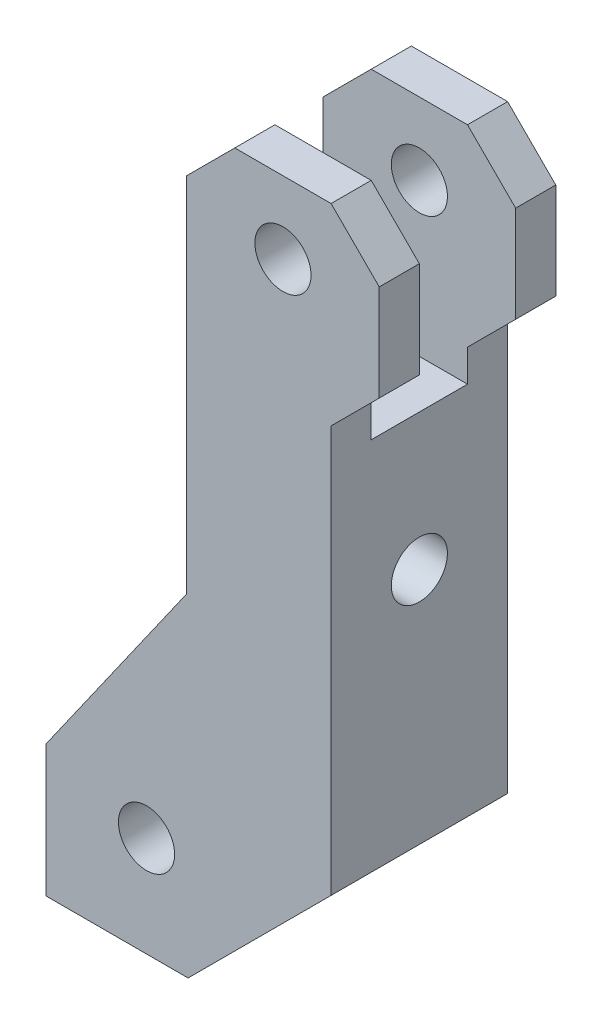
ISO-10303-21;
HEADER;
FILE_DESCRIPTION(('STEP AP214'),'2;1');
FILE_NAME('part.step','',(''),(''),'','','');
FILE_SCHEMA(('AUTOMOTIVE_DESIGN { 1 0 10303 214 1 1 1 1 }'));
ENDSEC;
DATA;
#1=APPLICATION_CONTEXT('core data for automotive mechanical design processes');
#2=APPLICATION_PROTOCOL_DEFINITION('international standard','automotive_design',2000,#1);
#3=PRODUCT_CONTEXT('',#1,'mechanical');
#4=PRODUCT('Part','Part','',(#3));
#5=PRODUCT_RELATED_PRODUCT_CATEGORY('part','',(#4));
#6=PRODUCT_DEFINITION_FORMATION('','',#4);
#7=PRODUCT_DEFINITION_CONTEXT('part definition',#1,'design');
#8=PRODUCT_DEFINITION('design','',#6,#7);
#9=PRODUCT_DEFINITION_SHAPE('','',#8);
#10=(LENGTH_UNIT() NAMED_UNIT(*) SI_UNIT(.MILLI.,.METRE.));
#11=(NAMED_UNIT(*) PLANE_ANGLE_UNIT() SI_UNIT($,.RADIAN.));
#12=(NAMED_UNIT(*) SI_UNIT($,.STERADIAN.) SOLID_ANGLE_UNIT());
#13=UNCERTAINTY_MEASURE_WITH_UNIT(LENGTH_MEASURE(1.E-05),#10,'distance_accuracy_value','');
#14=(GEOMETRIC_REPRESENTATION_CONTEXT(3) GLOBAL_UNCERTAINTY_ASSIGNED_CONTEXT((#13)) GLOBAL_UNIT_ASSIGNED_CONTEXT((#10,
#11,#12)) REPRESENTATION_CONTEXT('',''));
#15=CARTESIAN_POINT('',(0.,0.,0.));
#16=DIRECTION('',(0.,0.,1.));
#17=DIRECTION('',(1.,0.,0.));
#18=AXIS2_PLACEMENT_3D('',#15,#16,#17);
#19=CARTESIAN_POINT('',(23.,56.,-123.382937420455));
#20=DIRECTION('',(-0.707106781186542,0.707106781186553,0.));
#21=DIRECTION('',(-0.707106781186553,-0.707106781186542,0.));
#22=AXIS2_PLACEMENT_3D('',#19,#20,#21);
#23=PLANE('',#22);
#24=DIRECTION('',(-0.707106781186553,-0.707106781186542,0.));
#25=VECTOR('',#24,1.);
#26=CARTESIAN_POINT('',(23.,56.,-4.99999999999996));
#27=LINE('',#26,#25);
#28=CARTESIAN_POINT('',(29.,61.9999999999999,-4.99999999999996));
#29=VERTEX_POINT('',#28);
#30=CARTESIAN_POINT('',(23.,56.,-4.99999999999996));
#31=VERTEX_POINT('',#30);
#32=EDGE_CURVE('E163',#29,#31,#27,.T.);
#33=ORIENTED_EDGE('',*,*,#32,.F.);
#34=DIRECTION('',(0.,0.,1.));
#35=VECTOR('',#34,1.);
#36=CARTESIAN_POINT('',(29.,61.9999999999999,-123.382937420455));
#37=LINE('',#36,#35);
#38=CARTESIAN_POINT('',(29.,61.9999999999999,0.));
#39=VERTEX_POINT('',#38);
#40=EDGE_CURVE('E271',#29,#39,#37,.T.);
#41=ORIENTED_EDGE('',*,*,#40,.T.);
#42=DIRECTION('',(-0.707106781186553,-0.707106781186542,0.));
#43=VECTOR('',#42,1.);
#44=CARTESIAN_POINT('',(23.,56.,0.));
#45=LINE('',#44,#43);
#46=CARTESIAN_POINT('',(23.,56.,0.));
#47=VERTEX_POINT('',#46);
#48=EDGE_CURVE('E252',#39,#47,#45,.T.);
#49=ORIENTED_EDGE('',*,*,#48,.T.);
#50=DIRECTION('',(0.,0.,1.));
#51=VECTOR('',#50,1.);
#52=CARTESIAN_POINT('',(23.,56.,-123.382937420455));
#53=LINE('',#52,#51);
#54=EDGE_CURVE('E268',#31,#47,#53,.T.);
#55=ORIENTED_EDGE('',*,*,#54,.F.);
#56=EDGE_LOOP('',(#33,#41,#49,#55));
#57=FACE_BOUND('',#56,.T.);
#58=ADVANCED_FACE('F30',(#57),#23,.F.);
#59=CARTESIAN_POINT('',(29.,61.9999999999999,-123.382937420455));
#60=DIRECTION('',(-1.,0.,0.));
#61=DIRECTION('',(0.,0.,1.));
#62=AXIS2_PLACEMENT_3D('',#59,#60,#61);
#63=PLANE('',#62);
#64=DIRECTION('',(0.,-1.,0.));
#65=VECTOR('',#64,1.);
#66=CARTESIAN_POINT('',(29.,61.9999999999999,-4.99999999999996));
#67=LINE('',#66,#65);
#68=CARTESIAN_POINT('',(29.,74.,-4.99999999999996));
#69=VERTEX_POINT('',#68);
#70=EDGE_CURVE('E370',#69,#29,#67,.T.);
#71=ORIENTED_EDGE('',*,*,#70,.F.);
#72=DIRECTION('',(0.,0.,1.));
#73=VECTOR('',#72,1.);
#74=CARTESIAN_POINT('',(29.,74.,-123.382937420455));
#75=LINE('',#74,#73);
#76=CARTESIAN_POINT('',(29.,74.,0.));
#77=VERTEX_POINT('',#76);
#78=EDGE_CURVE('E275',#69,#77,#75,.T.);
#79=ORIENTED_EDGE('',*,*,#78,.T.);
#80=DIRECTION('',(0.,-1.,0.));
#81=VECTOR('',#80,1.);
#82=CARTESIAN_POINT('',(29.,61.9999999999999,0.));
#83=LINE('',#82,#81);
#84=EDGE_CURVE('E249',#77,#39,#83,.T.);
#85=ORIENTED_EDGE('',*,*,#84,.T.);
#86=ORIENTED_EDGE('',*,*,#40,.F.);
#87=EDGE_LOOP('',(#71,#79,#85,#86));
#88=FACE_BOUND('',#87,.T.);
#89=ADVANCED_FACE('F377',(#88),#63,.F.);
#90=CARTESIAN_POINT('',(29.,74.,-123.382937420455));
#91=DIRECTION('',(-0.707106781186549,-0.707106781186546,0.));
#92=DIRECTION('',(0.707106781186546,-0.707106781186549,0.));
#93=AXIS2_PLACEMENT_3D('',#90,#91,#92);
#94=PLANE('',#93);
#95=DIRECTION('',(0.707106781186546,-0.707106781186549,0.));
#96=VECTOR('',#95,1.);
#97=CARTESIAN_POINT('',(29.,74.,-4.99999999999996));
#98=LINE('',#97,#96);
#99=CARTESIAN_POINT('',(23.,80.,-4.99999999999996));
#100=VERTEX_POINT('',#99);
#101=EDGE_CURVE('E365',#100,#69,#98,.T.);
#102=ORIENTED_EDGE('',*,*,#101,.F.);
#103=DIRECTION('',(0.,0.,1.));
#104=VECTOR('',#103,1.);
#105=CARTESIAN_POINT('',(23.,80.,-123.382937420455));
#106=LINE('',#105,#104);
#107=CARTESIAN_POINT('',(23.,80.,0.));
#108=VERTEX_POINT('',#107);
#109=EDGE_CURVE('E279',#100,#108,#106,.T.);
#110=ORIENTED_EDGE('',*,*,#109,.T.);
#111=DIRECTION('',(0.707106781186546,-0.707106781186549,0.));
#112=VECTOR('',#111,1.);
#113=CARTESIAN_POINT('',(29.,74.,0.));
#114=LINE('',#113,#112);
#115=EDGE_CURVE('E246',#108,#77,#114,.T.);
#116=ORIENTED_EDGE('',*,*,#115,.T.);
#117=ORIENTED_EDGE('',*,*,#78,.F.);
#118=EDGE_LOOP('',(#102,#110,#116,#117));
#119=FACE_BOUND('',#118,.T.);
#120=ADVANCED_FACE('F401',(#119),#94,.F.);
#121=CARTESIAN_POINT('',(23.,80.,-123.382937420455));
#122=DIRECTION('',(0.,-1.,0.));
#123=DIRECTION('',(0.,0.,-1.));
#124=AXIS2_PLACEMENT_3D('',#121,#122,#123);
#125=PLANE('',#124);
#126=DIRECTION('',(1.,0.,0.));
#127=VECTOR('',#126,1.);
#128=CARTESIAN_POINT('',(23.,80.,-4.99999999999996));
#129=LINE('',#128,#127);
#130=CARTESIAN_POINT('',(11.,80.,-4.99999999999996));
#131=VERTEX_POINT('',#130);
#132=EDGE_CURVE('E363',#131,#100,#129,.T.);
#133=ORIENTED_EDGE('',*,*,#132,.F.);
#134=DIRECTION('',(0.,0.,1.));
#135=VECTOR('',#134,1.);
#136=CARTESIAN_POINT('',(11.,80.,-123.382937420455));
#137=LINE('',#136,#135);
#138=CARTESIAN_POINT('',(11.,80.,0.));
#139=VERTEX_POINT('',#138);
#140=EDGE_CURVE('E283',#131,#139,#137,.T.);
#141=ORIENTED_EDGE('',*,*,#140,.T.);
#142=DIRECTION('',(1.,0.,0.));
#143=VECTOR('',#142,1.);
#144=CARTESIAN_POINT('',(23.,80.,0.));
#145=LINE('',#144,#143);
#146=EDGE_CURVE('E243',#139,#108,#145,.T.);
#147=ORIENTED_EDGE('',*,*,#146,.T.);
#148=ORIENTED_EDGE('',*,*,#109,.F.);
#149=EDGE_LOOP('',(#133,#141,#147,#148));
#150=FACE_BOUND('',#149,.T.);
#151=ADVANCED_FACE('F414',(#150),#125,.F.);
#152=CARTESIAN_POINT('',(11.,80.,-123.382937420455));
#153=DIRECTION('',(0.707106781186546,-0.707106781186549,0.));
#154=DIRECTION('',(0.707106781186549,0.707106781186546,0.));
#155=AXIS2_PLACEMENT_3D('',#152,#153,#154);
#156=PLANE('',#155);
#157=DIRECTION('',(0.707106781186549,0.707106781186546,0.));
#158=VECTOR('',#157,1.);
#159=CARTESIAN_POINT('',(11.,80.,-4.99999999999996));
#160=LINE('',#159,#158);
#161=CARTESIAN_POINT('',(5.,74.,-4.99999999999996));
#162=VERTEX_POINT('',#161);
#163=EDGE_CURVE('E361',#162,#131,#160,.T.);
#164=ORIENTED_EDGE('',*,*,#163,.F.);
#165=DIRECTION('',(0.,0.,1.));
#166=VECTOR('',#165,1.);
#167=CARTESIAN_POINT('',(5.,74.,-123.382937420455));
#168=LINE('',#167,#166);
#169=CARTESIAN_POINT('',(5.,74.,0.));
#170=VERTEX_POINT('',#169);
#171=EDGE_CURVE('E287',#162,#170,#168,.T.);
#172=ORIENTED_EDGE('',*,*,#171,.T.);
#173=DIRECTION('',(0.707106781186549,0.707106781186546,0.));
#174=VECTOR('',#173,1.);
#175=CARTESIAN_POINT('',(11.,80.,0.));
#176=LINE('',#175,#174);
#177=EDGE_CURVE('E240',#170,#139,#176,.T.);
#178=ORIENTED_EDGE('',*,*,#177,.T.);
#179=ORIENTED_EDGE('',*,*,#140,.F.);
#180=EDGE_LOOP('',(#164,#172,#178,#179));
#181=FACE_BOUND('',#180,.T.);
#182=ADVANCED_FACE('F359',(#181),#156,.F.);
#183=CARTESIAN_POINT('',(17.,71.,-123.382937420455));
#184=DIRECTION('',(0.,0.,1.));
#185=DIRECTION('',(1.,0.,0.));
#186=AXIS2_PLACEMENT_3D('',#183,#184,#185);
#187=CYLINDRICAL_SURFACE('',#186,3.5);
#188=CARTESIAN_POINT('',(17.,71.,0.));
#189=DIRECTION('',(0.,0.,-1.));
#190=DIRECTION('',(-1.,0.,0.));
#191=AXIS2_PLACEMENT_3D('',#188,#189,#190);
#192=CIRCLE('',#191,3.5);
#193=CARTESIAN_POINT('',(13.5,71.,0.));
#194=VERTEX_POINT('',#193);
#195=EDGE_CURVE('E225',#194,#194,#192,.T.);
#196=ORIENTED_EDGE('',*,*,#195,.F.);
#197=EDGE_LOOP('',(#196));
#198=FACE_BOUND('',#197,.T.);
#199=CARTESIAN_POINT('',(17.,71.,-4.99999999999996));
#200=DIRECTION('',(0.,0.,-1.));
#201=DIRECTION('',(-1.,0.,0.));
#202=AXIS2_PLACEMENT_3D('',#199,#200,#201);
#203=CIRCLE('',#202,3.5);
#204=CARTESIAN_POINT('',(13.5,71.,-4.99999999999996));
#205=VERTEX_POINT('',#204);
#206=EDGE_CURVE('E294',#205,#205,#203,.T.);
#207=ORIENTED_EDGE('',*,*,#206,.T.);
#208=EDGE_LOOP('',(#207));
#209=FACE_BOUND('',#208,.T.);
#210=ADVANCED_FACE('F393',(#198,#209),#187,.F.);
#211=CARTESIAN_POINT('',(-12.5,-12.5,-123.382937420455));
#212=DIRECTION('',(0.,1.,0.));
#213=DIRECTION('',(-1.,0.,0.));
#214=AXIS2_PLACEMENT_3D('',#211,#212,#213);
#215=PLANE('',#214);
#216=DIRECTION('',(-1.,0.,0.));
#217=VECTOR('',#216,1.);
#218=CARTESIAN_POINT('',(-12.5,-12.5,-22.));
#219=LINE('',#218,#217);
#220=CARTESIAN_POINT('',(5.17766952966371,-12.5,-22.));
#221=VERTEX_POINT('',#220);
#222=CARTESIAN_POINT('',(-12.5,-12.5,-22.));
#223=VERTEX_POINT('',#222);
#224=EDGE_CURVE('E192',#221,#223,#219,.T.);
#225=ORIENTED_EDGE('',*,*,#224,.F.);
#226=DIRECTION('',(0.,0.,1.));
#227=VECTOR('',#226,1.);
#228=CARTESIAN_POINT('',(5.17766952966371,-12.5,-123.382937420455));
#229=LINE('',#228,#227);
#230=CARTESIAN_POINT('',(5.17766952966371,-12.5,0.));
#231=VERTEX_POINT('',#230);
#232=EDGE_CURVE('E54',#221,#231,#229,.T.);
#233=ORIENTED_EDGE('',*,*,#232,.T.);
#234=DIRECTION('',(-1.,0.,0.));
#235=VECTOR('',#234,1.);
#236=CARTESIAN_POINT('',(-12.5,-12.5,0.));
#237=LINE('',#236,#235);
#238=CARTESIAN_POINT('',(-12.5,-12.5,0.));
#239=VERTEX_POINT('',#238);
#240=EDGE_CURVE('E260',#231,#239,#237,.T.);
#241=ORIENTED_EDGE('',*,*,#240,.T.);
#242=DIRECTION('',(0.,0.,1.));
#243=VECTOR('',#242,1.);
#244=CARTESIAN_POINT('',(-12.5,-12.5,-123.382937420455));
#245=LINE('',#244,#243);
#246=EDGE_CURVE('E263',#223,#239,#245,.T.);
#247=ORIENTED_EDGE('',*,*,#246,.F.);
#248=EDGE_LOOP('',(#225,#233,#241,#247));
#249=FACE_BOUND('',#248,.T.);
#250=ADVANCED_FACE('F385',(#249),#215,.F.);
#251=CARTESIAN_POINT('',(5.17766952966371,-12.5,-123.382937420455));
#252=DIRECTION('',(-0.707106781186549,0.707106781186546,0.));
#253=DIRECTION('',(-0.707106781186546,-0.707106781186549,0.));
#254=AXIS2_PLACEMENT_3D('',#251,#252,#253);
#255=PLANE('',#254);
#256=DIRECTION('',(-0.707106781186546,-0.707106781186549,0.));
#257=VECTOR('',#256,1.);
#258=CARTESIAN_POINT('',(5.17766952966368,-12.5,-22.));
#259=LINE('',#258,#257);
#260=CARTESIAN_POINT('',(23.,5.32233047033636,-22.));
#261=VERTEX_POINT('',#260);
#262=EDGE_CURVE('E195',#261,#221,#259,.T.);
#263=ORIENTED_EDGE('',*,*,#262,.F.);
#264=DIRECTION('',(0.,0.,1.));
#265=VECTOR('',#264,1.);
#266=CARTESIAN_POINT('',(23.,5.32233047033636,-123.382937420455));
#267=LINE('',#266,#265);
#268=CARTESIAN_POINT('',(23.,5.32233047033636,0.));
#269=VERTEX_POINT('',#268);
#270=EDGE_CURVE('E266',#261,#269,#267,.T.);
#271=ORIENTED_EDGE('',*,*,#270,.T.);
#272=DIRECTION('',(-0.707106781186546,-0.707106781186549,0.));
#273=VECTOR('',#272,1.);
#274=CARTESIAN_POINT('',(5.17766952966371,-12.5,0.));
#275=LINE('',#274,#273);
#276=EDGE_CURVE('E258',#269,#231,#275,.T.);
#277=ORIENTED_EDGE('',*,*,#276,.T.);
#278=ORIENTED_EDGE('',*,*,#232,.F.);
#279=EDGE_LOOP('',(#263,#271,#277,#278));
#280=FACE_BOUND('',#279,.T.);
#281=ADVANCED_FACE('F383',(#280),#255,.F.);
#282=CARTESIAN_POINT('',(23.,5.32233047033636,-123.382937420455));
#283=DIRECTION('',(-1.,0.,0.));
#284=DIRECTION('',(0.,-1.,0.));
#285=AXIS2_PLACEMENT_3D('',#282,#283,#284);
#286=PLANE('',#285);
#287=CARTESIAN_POINT('',(23.,35.,-11.));
#288=DIRECTION('',(1.,0.,0.));
#289=DIRECTION('',(0.,1.,0.));
#290=AXIS2_PLACEMENT_3D('',#287,#288,#289);
#291=CIRCLE('',#290,3.50000000000001);
#292=CARTESIAN_POINT('',(23.,38.5,-11.));
#293=VERTEX_POINT('',#292);
#294=EDGE_CURVE('E459',#293,#293,#291,.T.);
#295=ORIENTED_EDGE('',*,*,#294,.F.);
#296=EDGE_LOOP('',(#295));
#297=FACE_BOUND('',#296,.T.);
#298=CARTESIAN_POINT('',(23.,56.,-22.));
#299=VERTEX_POINT('',#298);
#300=CARTESIAN_POINT('',(23.,56.,-17.));
#301=VERTEX_POINT('',#300);
#302=EDGE_CURVE('E269',#299,#301,#53,.T.);
#303=ORIENTED_EDGE('',*,*,#302,.T.);
#304=DIRECTION('',(0.,-1.,0.));
#305=VECTOR('',#304,1.);
#306=CARTESIAN_POINT('',(23.,5.32233047033636,-17.));
#307=LINE('',#306,#305);
#308=CARTESIAN_POINT('',(23.,52.,-17.));
#309=VERTEX_POINT('',#308);
#310=EDGE_CURVE('E180',#301,#309,#307,.T.);
#311=ORIENTED_EDGE('',*,*,#310,.T.);
#312=DIRECTION('',(0.,0.,1.));
#313=VECTOR('',#312,1.);
#314=CARTESIAN_POINT('',(23.,52.,-123.382937420455));
#315=LINE('',#314,#313);
#316=CARTESIAN_POINT('',(23.,52.,-4.99999999999997));
#317=VERTEX_POINT('',#316);
#318=EDGE_CURVE('E172',#309,#317,#315,.T.);
#319=ORIENTED_EDGE('',*,*,#318,.T.);
#320=DIRECTION('',(0.,-1.,0.));
#321=VECTOR('',#320,1.);
#322=CARTESIAN_POINT('',(23.,5.32233047033636,-4.99999999999996));
#323=LINE('',#322,#321);
#324=EDGE_CURVE('E160',#31,#317,#323,.T.);
#325=ORIENTED_EDGE('',*,*,#324,.F.);
#326=ORIENTED_EDGE('',*,*,#54,.T.);
#327=DIRECTION('',(0.,-1.,0.));
#328=VECTOR('',#327,1.);
#329=CARTESIAN_POINT('',(23.,5.32233047033636,0.));
#330=LINE('',#329,#328);
#331=EDGE_CURVE('E255',#47,#269,#330,.T.);
#332=ORIENTED_EDGE('',*,*,#331,.T.);
#333=ORIENTED_EDGE('',*,*,#270,.F.);
#334=DIRECTION('',(0.,-1.,0.));
#335=VECTOR('',#334,1.);
#336=CARTESIAN_POINT('',(23.,5.32233047033631,-22.));
#337=LINE('',#336,#335);
#338=EDGE_CURVE('E198',#299,#261,#337,.T.);
#339=ORIENTED_EDGE('',*,*,#338,.F.);
#340=EDGE_LOOP('',(#303,#311,#319,#325,#326,#332,#333,#339));
#341=FACE_BOUND('',#340,.T.);
#342=ADVANCED_FACE('F179',(#297,#341),#286,.F.);
#343=CARTESIAN_POINT('',(29.,61.9999999999999,-22.));
#344=VERTEX_POINT('',#343);
#345=CARTESIAN_POINT('',(29.,61.9999999999999,-17.));
#346=VERTEX_POINT('',#345);
#347=EDGE_CURVE('E272',#344,#346,#37,.T.);
#348=ORIENTED_EDGE('',*,*,#347,.T.);
#349=DIRECTION('',(-0.707106781186553,-0.707106781186542,0.));
#350=VECTOR('',#349,1.);
#351=CARTESIAN_POINT('',(23.,56.,-17.));
#352=LINE('',#351,#350);
#353=EDGE_CURVE('E186',#346,#301,#352,.T.);
#354=ORIENTED_EDGE('',*,*,#353,.T.);
#355=ORIENTED_EDGE('',*,*,#302,.F.);
#356=DIRECTION('',(-0.707106781186553,-0.707106781186542,0.));
#357=VECTOR('',#356,1.);
#358=CARTESIAN_POINT('',(23.,56.,-22.));
#359=LINE('',#358,#357);
#360=EDGE_CURVE('E201',#344,#299,#359,.T.);
#361=ORIENTED_EDGE('',*,*,#360,.F.);
#362=EDGE_LOOP('',(#348,#354,#355,#361));
#363=FACE_BOUND('',#362,.T.);
#364=ADVANCED_FACE('F322',(#363),#23,.F.);
#365=CARTESIAN_POINT('',(29.,74.,-22.));
#366=VERTEX_POINT('',#365);
#367=CARTESIAN_POINT('',(29.,74.,-17.));
#368=VERTEX_POINT('',#367);
#369=EDGE_CURVE('E276',#366,#368,#75,.T.);
#370=ORIENTED_EDGE('',*,*,#369,.T.);
#371=DIRECTION('',(0.,-1.,0.));
#372=VECTOR('',#371,1.);
#373=CARTESIAN_POINT('',(29.,61.9999999999999,-17.));
#374=LINE('',#373,#372);
#375=EDGE_CURVE('E317',#368,#346,#374,.T.);
#376=ORIENTED_EDGE('',*,*,#375,.T.);
#377=ORIENTED_EDGE('',*,*,#347,.F.);
#378=DIRECTION('',(0.,-1.,0.));
#379=VECTOR('',#378,1.);
#380=CARTESIAN_POINT('',(29.,61.9999999999999,-22.));
#381=LINE('',#380,#379);
#382=EDGE_CURVE('E204',#366,#344,#381,.T.);
#383=ORIENTED_EDGE('',*,*,#382,.F.);
#384=EDGE_LOOP('',(#370,#376,#377,#383));
#385=FACE_BOUND('',#384,.T.);
#386=ADVANCED_FACE('F329',(#385),#63,.F.);
#387=CARTESIAN_POINT('',(23.,80.,-21.9999999999999));
#388=VERTEX_POINT('',#387);
#389=CARTESIAN_POINT('',(23.,80.,-17.));
#390=VERTEX_POINT('',#389);
#391=EDGE_CURVE('E280',#388,#390,#106,.T.);
#392=ORIENTED_EDGE('',*,*,#391,.T.);
#393=DIRECTION('',(0.707106781186546,-0.707106781186549,0.));
#394=VECTOR('',#393,1.);
#395=CARTESIAN_POINT('',(29.,74.,-17.));
#396=LINE('',#395,#394);
#397=EDGE_CURVE('E314',#390,#368,#396,.T.);
#398=ORIENTED_EDGE('',*,*,#397,.T.);
#399=ORIENTED_EDGE('',*,*,#369,.F.);
#400=DIRECTION('',(0.707106781186546,-0.707106781186549,0.));
#401=VECTOR('',#400,1.);
#402=CARTESIAN_POINT('',(29.,74.,-21.9999999999999));
#403=LINE('',#402,#401);
#404=EDGE_CURVE('E207',#388,#366,#403,.T.);
#405=ORIENTED_EDGE('',*,*,#404,.F.);
#406=EDGE_LOOP('',(#392,#398,#399,#405));
#407=FACE_BOUND('',#406,.T.);
#408=ADVANCED_FACE('F333',(#407),#94,.F.);
#409=CARTESIAN_POINT('',(11.,80.,-21.9999999999999));
#410=VERTEX_POINT('',#409);
#411=CARTESIAN_POINT('',(11.,80.,-17.));
#412=VERTEX_POINT('',#411);
#413=EDGE_CURVE('E284',#410,#412,#137,.T.);
#414=ORIENTED_EDGE('',*,*,#413,.T.);
#415=DIRECTION('',(1.,0.,0.));
#416=VECTOR('',#415,1.);
#417=CARTESIAN_POINT('',(23.,80.,-17.));
#418=LINE('',#417,#416);
#419=EDGE_CURVE('E308',#412,#390,#418,.T.);
#420=ORIENTED_EDGE('',*,*,#419,.T.);
#421=ORIENTED_EDGE('',*,*,#391,.F.);
#422=DIRECTION('',(1.,0.,0.));
#423=VECTOR('',#422,1.);
#424=CARTESIAN_POINT('',(23.,80.,-21.9999999999999));
#425=LINE('',#424,#423);
#426=EDGE_CURVE('E210',#410,#388,#425,.T.);
#427=ORIENTED_EDGE('',*,*,#426,.F.);
#428=EDGE_LOOP('',(#414,#420,#421,#427));
#429=FACE_BOUND('',#428,.T.);
#430=ADVANCED_FACE('F336',(#429),#125,.F.);
#431=CARTESIAN_POINT('',(5.,74.,-21.9999999999999));
#432=VERTEX_POINT('',#431);
#433=CARTESIAN_POINT('',(5.,74.,-17.));
#434=VERTEX_POINT('',#433);
#435=EDGE_CURVE('E288',#432,#434,#168,.T.);
#436=ORIENTED_EDGE('',*,*,#435,.T.);
#437=DIRECTION('',(0.707106781186549,0.707106781186546,0.));
#438=VECTOR('',#437,1.);
#439=CARTESIAN_POINT('',(11.,80.,-17.));
#440=LINE('',#439,#438);
#441=EDGE_CURVE('E303',#434,#412,#440,.T.);
#442=ORIENTED_EDGE('',*,*,#441,.T.);
#443=ORIENTED_EDGE('',*,*,#413,.F.);
#444=DIRECTION('',(0.707106781186549,0.707106781186546,0.));
#445=VECTOR('',#444,1.);
#446=CARTESIAN_POINT('',(11.,79.9999999999999,-21.9999999999999));
#447=LINE('',#446,#445);
#448=EDGE_CURVE('E213',#432,#410,#447,.T.);
#449=ORIENTED_EDGE('',*,*,#448,.F.);
#450=EDGE_LOOP('',(#436,#442,#443,#449));
#451=FACE_BOUND('',#450,.T.);
#452=ADVANCED_FACE('F339',(#451),#156,.F.);
#453=CARTESIAN_POINT('',(5.,74.,-123.382937420455));
#454=DIRECTION('',(1.,0.,0.));
#455=DIRECTION('',(0.,1.,0.));
#456=AXIS2_PLACEMENT_3D('',#453,#454,#455);
#457=PLANE('',#456);
#458=CARTESIAN_POINT('',(5.00000000000002,35.,-11.));
#459=DIRECTION('',(1.,0.,0.));
#460=DIRECTION('',(0.,1.,0.));
#461=AXIS2_PLACEMENT_3D('',#458,#459,#460);
#462=CIRCLE('',#461,3.50000000000001);
#463=CARTESIAN_POINT('',(5.00000000000002,38.5,-11.));
#464=VERTEX_POINT('',#463);
#465=EDGE_CURVE('E34',#464,#464,#462,.T.);
#466=ORIENTED_EDGE('',*,*,#465,.T.);
#467=EDGE_LOOP('',(#466));
#468=FACE_BOUND('',#467,.T.);
#469=DIRECTION('',(0.,0.,-1.));
#470=VECTOR('',#469,1.);
#471=CARTESIAN_POINT('',(5.,52.,-123.382937420455));
#472=LINE('',#471,#470);
#473=CARTESIAN_POINT('',(5.,52.,-4.99999999999996));
#474=VERTEX_POINT('',#473);
#475=CARTESIAN_POINT('',(5.,52.,-17.));
#476=VERTEX_POINT('',#475);
#477=EDGE_CURVE('E11',#474,#476,#472,.T.);
#478=ORIENTED_EDGE('',*,*,#477,.T.);
#479=DIRECTION('',(0.,1.,0.));
#480=VECTOR('',#479,1.);
#481=CARTESIAN_POINT('',(5.,74.,-17.));
#482=LINE('',#481,#480);
#483=EDGE_CURVE('E299',#476,#434,#482,.T.);
#484=ORIENTED_EDGE('',*,*,#483,.T.);
#485=ORIENTED_EDGE('',*,*,#435,.F.);
#486=DIRECTION('',(0.,1.,0.));
#487=VECTOR('',#486,1.);
#488=CARTESIAN_POINT('',(5.00000000000002,74.,-22.));
#489=LINE('',#488,#487);
#490=CARTESIAN_POINT('',(5.00000000000002,28.8649081657271,-22.));
#491=VERTEX_POINT('',#490);
#492=EDGE_CURVE('E216',#491,#432,#489,.T.);
#493=ORIENTED_EDGE('',*,*,#492,.F.);
#494=DIRECTION('',(0.,0.,1.));
#495=VECTOR('',#494,1.);
#496=CARTESIAN_POINT('',(5.00000000000002,28.8649081657271,-123.382937420455));
#497=LINE('',#496,#495);
#498=CARTESIAN_POINT('',(5.00000000000002,28.8649081657271,0.));
#499=VERTEX_POINT('',#498);
#500=EDGE_CURVE('E291',#491,#499,#497,.T.);
#501=ORIENTED_EDGE('',*,*,#500,.T.);
#502=DIRECTION('',(0.,1.,0.));
#503=VECTOR('',#502,1.);
#504=CARTESIAN_POINT('',(5.,74.,0.));
#505=LINE('',#504,#503);
#506=EDGE_CURVE('E237',#499,#170,#505,.T.);
#507=ORIENTED_EDGE('',*,*,#506,.T.);
#508=ORIENTED_EDGE('',*,*,#171,.F.);
#509=DIRECTION('',(0.,1.,0.));
#510=VECTOR('',#509,1.);
#511=CARTESIAN_POINT('',(5.,74.,-4.99999999999996));
#512=LINE('',#511,#510);
#513=EDGE_CURVE('E297',#474,#162,#512,.T.);
#514=ORIENTED_EDGE('',*,*,#513,.F.);
#515=EDGE_LOOP('',(#478,#484,#485,#493,#501,#507,#508,#514));
#516=FACE_BOUND('',#515,.T.);
#517=ADVANCED_FACE('F340',(#468,#516),#457,.F.);
#518=CARTESIAN_POINT('',(5.00000000000002,28.8649081657271,-123.382937420455));
#519=DIRECTION('',(0.81829565841525,-0.574797542982529,0.));
#520=DIRECTION('',(0.574797542982529,0.81829565841525,0.));
#521=AXIS2_PLACEMENT_3D('',#518,#519,#520);
#522=PLANE('',#521);
#523=DIRECTION('',(0.574797542982529,0.81829565841525,0.));
#524=VECTOR('',#523,1.);
#525=CARTESIAN_POINT('',(4.99999999999999,28.864908165727,-22.));
#526=LINE('',#525,#524);
#527=CARTESIAN_POINT('',(-12.5,3.95148569707509,-22.));
#528=VERTEX_POINT('',#527);
#529=EDGE_CURVE('E219',#528,#491,#526,.T.);
#530=ORIENTED_EDGE('',*,*,#529,.F.);
#531=DIRECTION('',(0.,0.,1.));
#532=VECTOR('',#531,1.);
#533=CARTESIAN_POINT('',(-12.5,3.95148569707509,-123.382937420455));
#534=LINE('',#533,#532);
#535=CARTESIAN_POINT('',(-12.5,3.95148569707509,0.));
#536=VERTEX_POINT('',#535);
#537=EDGE_CURVE('E39',#528,#536,#534,.T.);
#538=ORIENTED_EDGE('',*,*,#537,.T.);
#539=DIRECTION('',(0.574797542982529,0.81829565841525,0.));
#540=VECTOR('',#539,1.);
#541=CARTESIAN_POINT('',(5.00000000000002,28.8649081657271,0.));
#542=LINE('',#541,#540);
#543=EDGE_CURVE('E234',#536,#499,#542,.T.);
#544=ORIENTED_EDGE('',*,*,#543,.T.);
#545=ORIENTED_EDGE('',*,*,#500,.F.);
#546=EDGE_LOOP('',(#530,#538,#544,#545));
#547=FACE_BOUND('',#546,.T.);
#548=ADVANCED_FACE('F343',(#547),#522,.F.);
#549=CARTESIAN_POINT('',(-12.5,3.95148569707509,-123.382937420455));
#550=DIRECTION('',(1.,0.,0.));
#551=DIRECTION('',(0.,1.,0.));
#552=AXIS2_PLACEMENT_3D('',#549,#550,#551);
#553=PLANE('',#552);
#554=DIRECTION('',(0.,1.,0.));
#555=VECTOR('',#554,1.);
#556=CARTESIAN_POINT('',(-12.5,3.95148569707504,-22.));
#557=LINE('',#556,#555);
#558=EDGE_CURVE('E222',#223,#528,#557,.T.);
#559=ORIENTED_EDGE('',*,*,#558,.F.);
#560=ORIENTED_EDGE('',*,*,#246,.T.);
#561=DIRECTION('',(0.,1.,0.));
#562=VECTOR('',#561,1.);
#563=CARTESIAN_POINT('',(-12.5,3.95148569707509,0.));
#564=LINE('',#563,#562);
#565=EDGE_CURVE('E231',#239,#536,#564,.T.);
#566=ORIENTED_EDGE('',*,*,#565,.T.);
#567=ORIENTED_EDGE('',*,*,#537,.F.);
#568=EDGE_LOOP('',(#559,#560,#566,#567));
#569=FACE_BOUND('',#568,.T.);
#570=ADVANCED_FACE('F32',(#569),#553,.F.);
#571=CARTESIAN_POINT('',(0.,0.,-123.382937420455));
#572=DIRECTION('',(0.,0.,1.));
#573=DIRECTION('',(1.,0.,0.));
#574=AXIS2_PLACEMENT_3D('',#571,#572,#573);
#575=CYLINDRICAL_SURFACE('',#574,3.5);
#576=CARTESIAN_POINT('',(0.,0.,0.));
#577=DIRECTION('',(0.,0.,-1.));
#578=DIRECTION('',(-1.,0.,0.));
#579=AXIS2_PLACEMENT_3D('',#576,#577,#578);
#580=CIRCLE('',#579,3.5);
#581=CARTESIAN_POINT('',(-3.5,0.,0.));
#582=VERTEX_POINT('',#581);
#583=EDGE_CURVE('E228',#582,#582,#580,.T.);
#584=ORIENTED_EDGE('',*,*,#583,.F.);
#585=EDGE_LOOP('',(#584));
#586=FACE_BOUND('',#585,.T.);
#587=CARTESIAN_POINT('',(0.,0.,-22.));
#588=DIRECTION('',(0.,0.,-1.));
#589=DIRECTION('',(0.,1.,0.));
#590=AXIS2_PLACEMENT_3D('',#587,#588,#589);
#591=CIRCLE('',#590,3.5);
#592=CARTESIAN_POINT('',(0.,3.5,-22.));
#593=VERTEX_POINT('',#592);
#594=EDGE_CURVE('E184',#593,#593,#591,.T.);
#595=ORIENTED_EDGE('',*,*,#594,.T.);
#596=EDGE_LOOP('',(#595));
#597=FACE_BOUND('',#596,.T.);
#598=ADVANCED_FACE('F423',(#586,#597),#575,.F.);
#599=CARTESIAN_POINT('',(-12.5,80.,0.));
#600=DIRECTION('',(0.,0.,-1.));
#601=DIRECTION('',(-1.,0.,0.));
#602=AXIS2_PLACEMENT_3D('',#599,#600,#601);
#603=PLANE('',#602);
#604=ORIENTED_EDGE('',*,*,#583,.T.);
#605=EDGE_LOOP('',(#604));
#606=FACE_BOUND('',#605,.T.);
#607=ORIENTED_EDGE('',*,*,#565,.F.);
#608=ORIENTED_EDGE('',*,*,#240,.F.);
#609=ORIENTED_EDGE('',*,*,#276,.F.);
#610=ORIENTED_EDGE('',*,*,#331,.F.);
#611=ORIENTED_EDGE('',*,*,#48,.F.);
#612=ORIENTED_EDGE('',*,*,#84,.F.);
#613=ORIENTED_EDGE('',*,*,#115,.F.);
#614=ORIENTED_EDGE('',*,*,#146,.F.);
#615=ORIENTED_EDGE('',*,*,#177,.F.);
#616=ORIENTED_EDGE('',*,*,#506,.F.);
#617=ORIENTED_EDGE('',*,*,#543,.F.);
#618=EDGE_LOOP('',(#607,#608,#609,#610,#611,#612,#613,#614,#615,#616,#617));
#619=FACE_BOUND('',#618,.T.);
#620=ORIENTED_EDGE('',*,*,#195,.T.);
#621=EDGE_LOOP('',(#620));
#622=FACE_BOUND('',#621,.T.);
#623=ADVANCED_FACE('F351',(#606,#619,#622),#603,.F.);
#624=CARTESIAN_POINT('',(17.,71.,-17.));
#625=DIRECTION('',(0.,0.,-1.));
#626=DIRECTION('',(-1.,0.,0.));
#627=AXIS2_PLACEMENT_3D('',#624,#625,#626);
#628=CIRCLE('',#627,3.5);
#629=CARTESIAN_POINT('',(13.5,71.,-17.));
#630=VERTEX_POINT('',#629);
#631=EDGE_CURVE('E167',#630,#630,#628,.T.);
#632=ORIENTED_EDGE('',*,*,#631,.F.);
#633=EDGE_LOOP('',(#632));
#634=FACE_BOUND('',#633,.T.);
#635=CARTESIAN_POINT('',(17.,71.,-22.));
#636=DIRECTION('',(0.,0.,-1.));
#637=DIRECTION('',(0.,1.,0.));
#638=AXIS2_PLACEMENT_3D('',#635,#636,#637);
#639=CIRCLE('',#638,3.5);
#640=CARTESIAN_POINT('',(17.,74.5,-21.9999999999999));
#641=VERTEX_POINT('',#640);
#642=EDGE_CURVE('E181',#641,#641,#639,.T.);
#643=ORIENTED_EDGE('',*,*,#642,.T.);
#644=EDGE_LOOP('',(#643));
#645=FACE_BOUND('',#644,.T.);
#646=ADVANCED_FACE('F432',(#634,#645),#187,.F.);
#647=CARTESIAN_POINT('',(-15.4236926956022,-13.6534270244129,-22.));
#648=DIRECTION('',(0.,0.,-1.));
#649=DIRECTION('',(-0.0432676217188423,0.999063517956088,0.));
#650=AXIS2_PLACEMENT_3D('',#647,#648,#649);
#651=PLANE('',#650);
#652=ORIENTED_EDGE('',*,*,#642,.F.);
#653=EDGE_LOOP('',(#652));
#654=FACE_BOUND('',#653,.T.);
#655=ORIENTED_EDGE('',*,*,#594,.F.);
#656=EDGE_LOOP('',(#655));
#657=FACE_BOUND('',#656,.T.);
#658=ORIENTED_EDGE('',*,*,#224,.T.);
#659=ORIENTED_EDGE('',*,*,#558,.T.);
#660=ORIENTED_EDGE('',*,*,#529,.T.);
#661=ORIENTED_EDGE('',*,*,#492,.T.);
#662=ORIENTED_EDGE('',*,*,#448,.T.);
#663=ORIENTED_EDGE('',*,*,#426,.T.);
#664=ORIENTED_EDGE('',*,*,#404,.T.);
#665=ORIENTED_EDGE('',*,*,#382,.T.);
#666=ORIENTED_EDGE('',*,*,#360,.T.);
#667=ORIENTED_EDGE('',*,*,#338,.T.);
#668=ORIENTED_EDGE('',*,*,#262,.T.);
#669=EDGE_LOOP('',(#658,#659,#660,#661,#662,#663,#664,#665,#666,#667,#668));
#670=FACE_BOUND('',#669,.T.);
#671=ADVANCED_FACE('F327',(#654,#657,#670),#651,.T.);
#672=CARTESIAN_POINT('',(-3.84150326797385,52.,-17.));
#673=DIRECTION('',(0.,-1.,0.));
#674=DIRECTION('',(0.,0.,-1.));
#675=AXIS2_PLACEMENT_3D('',#672,#673,#674);
#676=PLANE('',#675);
#677=DIRECTION('',(1.,0.,0.));
#678=VECTOR('',#677,1.);
#679=CARTESIAN_POINT('',(-3.84150326797385,52.,-17.));
#680=LINE('',#679,#678);
#681=EDGE_CURVE('E175',#476,#309,#680,.T.);
#682=ORIENTED_EDGE('',*,*,#681,.F.);
#683=ORIENTED_EDGE('',*,*,#477,.F.);
#684=DIRECTION('',(1.,0.,0.));
#685=VECTOR('',#684,1.);
#686=CARTESIAN_POINT('',(-3.84150326797385,52.,-4.99999999999997));
#687=LINE('',#686,#685);
#688=EDGE_CURVE('E46',#474,#317,#687,.T.);
#689=ORIENTED_EDGE('',*,*,#688,.T.);
#690=ORIENTED_EDGE('',*,*,#318,.F.);
#691=EDGE_LOOP('',(#682,#683,#689,#690));
#692=FACE_BOUND('',#691,.T.);
#693=ADVANCED_FACE('F171',(#692),#676,.F.);
#694=CARTESIAN_POINT('',(-3.84150326797383,86.909340080118,-17.));
#695=DIRECTION('',(0.,0.,-1.));
#696=DIRECTION('',(-1.,0.,0.));
#697=AXIS2_PLACEMENT_3D('',#694,#695,#696);
#698=PLANE('',#697);
#699=ORIENTED_EDGE('',*,*,#631,.T.);
#700=EDGE_LOOP('',(#699));
#701=FACE_BOUND('',#700,.T.);
#702=ORIENTED_EDGE('',*,*,#353,.F.);
#703=ORIENTED_EDGE('',*,*,#375,.F.);
#704=ORIENTED_EDGE('',*,*,#397,.F.);
#705=ORIENTED_EDGE('',*,*,#419,.F.);
#706=ORIENTED_EDGE('',*,*,#441,.F.);
#707=ORIENTED_EDGE('',*,*,#483,.F.);
#708=ORIENTED_EDGE('',*,*,#681,.T.);
#709=ORIENTED_EDGE('',*,*,#310,.F.);
#710=EDGE_LOOP('',(#702,#703,#704,#705,#706,#707,#708,#709));
#711=FACE_BOUND('',#710,.T.);
#712=ADVANCED_FACE('F331',(#701,#711),#698,.F.);
#713=CARTESIAN_POINT('',(-3.84150326797383,86.909340080118,-4.99999999999997));
#714=DIRECTION('',(0.,0.,-1.));
#715=DIRECTION('',(-1.,0.,0.));
#716=AXIS2_PLACEMENT_3D('',#713,#714,#715);
#717=PLANE('',#716);
#718=ORIENTED_EDGE('',*,*,#206,.F.);
#719=EDGE_LOOP('',(#718));
#720=FACE_BOUND('',#719,.T.);
#721=ORIENTED_EDGE('',*,*,#324,.T.);
#722=ORIENTED_EDGE('',*,*,#688,.F.);
#723=ORIENTED_EDGE('',*,*,#513,.T.);
#724=ORIENTED_EDGE('',*,*,#163,.T.);
#725=ORIENTED_EDGE('',*,*,#132,.T.);
#726=ORIENTED_EDGE('',*,*,#101,.T.);
#727=ORIENTED_EDGE('',*,*,#70,.T.);
#728=ORIENTED_EDGE('',*,*,#32,.T.);
#729=EDGE_LOOP('',(#721,#722,#723,#724,#725,#726,#727,#728));
#730=FACE_BOUND('',#729,.T.);
#731=ADVANCED_FACE('F161',(#720,#730),#717,.T.);
#732=CARTESIAN_POINT('',(-12.5,35.,-11.));
#733=DIRECTION('',(1.,0.,0.));
#734=DIRECTION('',(0.,1.,0.));
#735=AXIS2_PLACEMENT_3D('',#732,#733,#734);
#736=CYLINDRICAL_SURFACE('',#735,3.50000000000001);
#737=ORIENTED_EDGE('',*,*,#294,.T.);
#738=EDGE_LOOP('',(#737));
#739=FACE_BOUND('',#738,.T.);
#740=ORIENTED_EDGE('',*,*,#465,.F.);
#741=EDGE_LOOP('',(#740));
#742=FACE_BOUND('',#741,.T.);
#743=ADVANCED_FACE('F448',(#739,#742),#736,.F.);
#744=CLOSED_SHELL('',(#58,#89,#120,#151,#182,#210,#250,#281,#342,#364,#386,#408,#430,#452,#517,
#548,#570,#598,#623,#646,#671,#693,#712,#731,#743));
#745=MANIFOLD_SOLID_BREP('B2',#744);
#746=ADVANCED_BREP_SHAPE_REPRESENTATION('',(#18,#745),#14);
#747=SHAPE_DEFINITION_REPRESENTATION(#9,#746);
ENDSEC;
END-ISO-10303-21;
